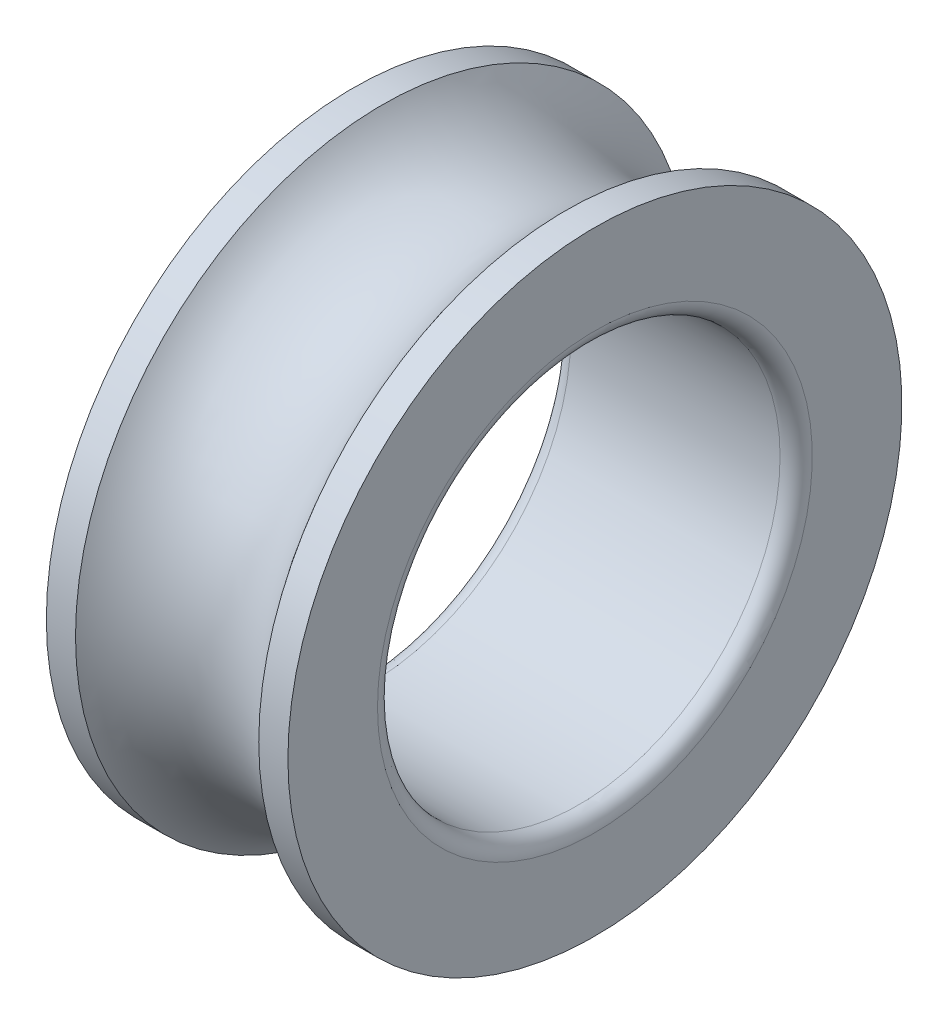
ISO-10303-21;
HEADER;
FILE_DESCRIPTION(('STEP AP214'),'2;1');
FILE_NAME('part.step','',(''),(''),'','','');
FILE_SCHEMA(('AUTOMOTIVE_DESIGN { 1 0 10303 214 1 1 1 1 }'));
ENDSEC;
DATA;
#1=APPLICATION_CONTEXT('core data for automotive mechanical design processes');
#2=APPLICATION_PROTOCOL_DEFINITION('international standard','automotive_design',2000,#1);
#3=PRODUCT_CONTEXT('',#1,'mechanical');
#4=PRODUCT('Part','Part','',(#3));
#5=PRODUCT_RELATED_PRODUCT_CATEGORY('part','',(#4));
#6=PRODUCT_DEFINITION_FORMATION('','',#4);
#7=PRODUCT_DEFINITION_CONTEXT('part definition',#1,'design');
#8=PRODUCT_DEFINITION('design','',#6,#7);
#9=PRODUCT_DEFINITION_SHAPE('','',#8);
#10=(LENGTH_UNIT() NAMED_UNIT(*) SI_UNIT(.MILLI.,.METRE.));
#11=(NAMED_UNIT(*) PLANE_ANGLE_UNIT() SI_UNIT($,.RADIAN.));
#12=(NAMED_UNIT(*) SI_UNIT($,.STERADIAN.) SOLID_ANGLE_UNIT());
#13=UNCERTAINTY_MEASURE_WITH_UNIT(LENGTH_MEASURE(1.E-05),#10,'distance_accuracy_value','');
#14=(GEOMETRIC_REPRESENTATION_CONTEXT(3) GLOBAL_UNCERTAINTY_ASSIGNED_CONTEXT((#13)) GLOBAL_UNIT_ASSIGNED_CONTEXT((#10,
#11,#12)) REPRESENTATION_CONTEXT('',''));
#15=CARTESIAN_POINT('',(0.,0.,0.));
#16=DIRECTION('',(0.,0.,1.));
#17=DIRECTION('',(1.,0.,0.));
#18=AXIS2_PLACEMENT_3D('',#15,#16,#17);
#19=CARTESIAN_POINT('',(22.5,40.5,0.));
#20=DIRECTION('',(-1.,0.,0.));
#21=DIRECTION('',(0.,0.,1.));
#22=AXIS2_PLACEMENT_3D('',#19,#20,#21);
#23=PLANE('',#22);
#24=CARTESIAN_POINT('',(22.5,0.,0.));
#25=DIRECTION('',(-1.,0.,0.));
#26=DIRECTION('',(0.,0.,1.));
#27=AXIS2_PLACEMENT_3D('',#24,#25,#26);
#28=CIRCLE('',#27,57.19);
#29=CARTESIAN_POINT('',(22.5,0.,57.19));
#30=VERTEX_POINT('',#29);
#31=EDGE_CURVE('E63',#30,#30,#28,.T.);
#32=ORIENTED_EDGE('',*,*,#31,.F.);
#33=EDGE_LOOP('',(#32));
#34=FACE_BOUND('',#33,.T.);
#35=CARTESIAN_POINT('',(22.5,0.,0.));
#36=DIRECTION('',(-1.,0.,0.));
#37=DIRECTION('',(0.,0.,1.));
#38=AXIS2_PLACEMENT_3D('',#35,#36,#37);
#39=CIRCLE('',#38,40.5);
#40=CARTESIAN_POINT('',(22.5,0.,40.5));
#41=VERTEX_POINT('',#40);
#42=EDGE_CURVE('E10',#41,#41,#39,.T.);
#43=ORIENTED_EDGE('',*,*,#42,.T.);
#44=EDGE_LOOP('',(#43));
#45=FACE_BOUND('',#44,.T.);
#46=ADVANCED_FACE('F35',(#34,#45),#23,.F.);
#47=CARTESIAN_POINT('',(19.5,0.,0.));
#48=DIRECTION('',(-1.,0.,0.));
#49=DIRECTION('',(0.,0.,1.));
#50=AXIS2_PLACEMENT_3D('',#47,#48,#49);
#51=TOROIDAL_SURFACE('',#50,40.5,3.);
#52=ORIENTED_EDGE('',*,*,#42,.F.);
#53=EDGE_LOOP('',(#52));
#54=FACE_BOUND('',#53,.T.);
#55=CARTESIAN_POINT('',(19.5,0.,0.));
#56=DIRECTION('',(-1.,0.,0.));
#57=DIRECTION('',(0.,0.,1.));
#58=AXIS2_PLACEMENT_3D('',#55,#56,#57);
#59=CIRCLE('',#58,37.5);
#60=CARTESIAN_POINT('',(19.5,0.,37.5));
#61=VERTEX_POINT('',#60);
#62=EDGE_CURVE('E41',#61,#61,#59,.T.);
#63=ORIENTED_EDGE('',*,*,#62,.T.);
#64=EDGE_LOOP('',(#63));
#65=FACE_BOUND('',#64,.T.);
#66=ADVANCED_FACE('F70',(#54,#65),#51,.T.);
#67=CARTESIAN_POINT('',(-18.9011127816473,0.,0.));
#68=DIRECTION('',(-1.,0.,0.));
#69=DIRECTION('',(0.,0.,1.));
#70=AXIS2_PLACEMENT_3D('',#67,#68,#69);
#71=CYLINDRICAL_SURFACE('',#70,37.5);
#72=ORIENTED_EDGE('',*,*,#62,.F.);
#73=EDGE_LOOP('',(#72));
#74=FACE_BOUND('',#73,.T.);
#75=CARTESIAN_POINT('',(-19.5,0.,0.));
#76=DIRECTION('',(-1.,0.,0.));
#77=DIRECTION('',(0.,0.,1.));
#78=AXIS2_PLACEMENT_3D('',#75,#76,#77);
#79=CIRCLE('',#78,37.5);
#80=CARTESIAN_POINT('',(-19.5,0.,37.5));
#81=VERTEX_POINT('',#80);
#82=EDGE_CURVE('E45',#81,#81,#79,.T.);
#83=ORIENTED_EDGE('',*,*,#82,.T.);
#84=EDGE_LOOP('',(#83));
#85=FACE_BOUND('',#84,.T.);
#86=ADVANCED_FACE('F74',(#74,#85),#71,.F.);
#87=CARTESIAN_POINT('',(-19.5,0.,0.));
#88=DIRECTION('',(-1.,0.,0.));
#89=DIRECTION('',(0.,0.,1.));
#90=AXIS2_PLACEMENT_3D('',#87,#88,#89);
#91=TOROIDAL_SURFACE('',#90,40.5,3.);
#92=ORIENTED_EDGE('',*,*,#82,.F.);
#93=EDGE_LOOP('',(#92));
#94=FACE_BOUND('',#93,.T.);
#95=CARTESIAN_POINT('',(-22.5,0.,0.));
#96=DIRECTION('',(-1.,0.,0.));
#97=DIRECTION('',(0.,0.,1.));
#98=AXIS2_PLACEMENT_3D('',#95,#96,#97);
#99=CIRCLE('',#98,40.5);
#100=CARTESIAN_POINT('',(-22.5,0.,40.5));
#101=VERTEX_POINT('',#100);
#102=EDGE_CURVE('E49',#101,#101,#99,.T.);
#103=ORIENTED_EDGE('',*,*,#102,.T.);
#104=EDGE_LOOP('',(#103));
#105=FACE_BOUND('',#104,.T.);
#106=ADVANCED_FACE('F79',(#94,#105),#91,.T.);
#107=CARTESIAN_POINT('',(-22.5,40.5,0.));
#108=DIRECTION('',(1.,0.,0.));
#109=DIRECTION('',(0.,0.,-1.));
#110=AXIS2_PLACEMENT_3D('',#107,#108,#109);
#111=PLANE('',#110);
#112=ORIENTED_EDGE('',*,*,#102,.F.);
#113=EDGE_LOOP('',(#112));
#114=FACE_BOUND('',#113,.T.);
#115=CARTESIAN_POINT('',(-22.5,0.,0.));
#116=DIRECTION('',(-1.,0.,0.));
#117=DIRECTION('',(0.,0.,1.));
#118=AXIS2_PLACEMENT_3D('',#115,#116,#117);
#119=CIRCLE('',#118,57.19);
#120=CARTESIAN_POINT('',(-22.5,0.,57.19));
#121=VERTEX_POINT('',#120);
#122=EDGE_CURVE('E54',#121,#121,#119,.T.);
#123=ORIENTED_EDGE('',*,*,#122,.T.);
#124=EDGE_LOOP('',(#123));
#125=FACE_BOUND('',#124,.T.);
#126=ADVANCED_FACE('F85',(#114,#125),#111,.F.);
#127=CARTESIAN_POINT('',(-18.9011127816473,0.,0.));
#128=DIRECTION('',(-1.,0.,0.));
#129=DIRECTION('',(0.,0.,1.));
#130=AXIS2_PLACEMENT_3D('',#127,#128,#129);
#131=CYLINDRICAL_SURFACE('',#130,57.19);
#132=ORIENTED_EDGE('',*,*,#122,.F.);
#133=EDGE_LOOP('',(#132));
#134=FACE_BOUND('',#133,.T.);
#135=CARTESIAN_POINT('',(-17.0681721341215,0.,0.));
#136=DIRECTION('',(-1.,0.,0.));
#137=DIRECTION('',(0.,0.,1.));
#138=AXIS2_PLACEMENT_3D('',#135,#136,#137);
#139=CIRCLE('',#138,57.19);
#140=CARTESIAN_POINT('',(-17.0681721341215,0.,57.19));
#141=VERTEX_POINT('',#140);
#142=EDGE_CURVE('E57',#141,#141,#139,.T.);
#143=ORIENTED_EDGE('',*,*,#142,.T.);
#144=EDGE_LOOP('',(#143));
#145=FACE_BOUND('',#144,.T.);
#146=ADVANCED_FACE('F89',(#134,#145),#131,.T.);
#147=CARTESIAN_POINT('',(0.,0.,0.));
#148=DIRECTION('',(-1.,0.,0.));
#149=DIRECTION('',(0.,0.,1.));
#150=AXIS2_PLACEMENT_3D('',#147,#148,#149);
#151=TOROIDAL_SURFACE('',#150,68.99,20.75);
#152=ORIENTED_EDGE('',*,*,#142,.F.);
#153=EDGE_LOOP('',(#152));
#154=FACE_BOUND('',#153,.T.);
#155=CARTESIAN_POINT('',(17.0681721341215,0.,0.));
#156=DIRECTION('',(-1.,0.,0.));
#157=DIRECTION('',(0.,0.,1.));
#158=AXIS2_PLACEMENT_3D('',#155,#156,#157);
#159=CIRCLE('',#158,57.19);
#160=CARTESIAN_POINT('',(17.0681721341215,0.,57.19));
#161=VERTEX_POINT('',#160);
#162=EDGE_CURVE('E60',#161,#161,#159,.T.);
#163=ORIENTED_EDGE('',*,*,#162,.T.);
#164=EDGE_LOOP('',(#163));
#165=FACE_BOUND('',#164,.T.);
#166=ADVANCED_FACE('F93',(#154,#165),#151,.F.);
#167=CARTESIAN_POINT('',(-18.9011127816473,0.,0.));
#168=DIRECTION('',(-1.,0.,0.));
#169=DIRECTION('',(0.,0.,1.));
#170=AXIS2_PLACEMENT_3D('',#167,#168,#169);
#171=CYLINDRICAL_SURFACE('',#170,57.19);
#172=ORIENTED_EDGE('',*,*,#162,.F.);
#173=EDGE_LOOP('',(#172));
#174=FACE_BOUND('',#173,.T.);
#175=ORIENTED_EDGE('',*,*,#31,.T.);
#176=EDGE_LOOP('',(#175));
#177=FACE_BOUND('',#176,.T.);
#178=ADVANCED_FACE('F67',(#174,#177),#171,.T.);
#179=CLOSED_SHELL('',(#46,#66,#86,#106,#126,#146,#166,#178));
#180=MANIFOLD_SOLID_BREP('B2',#179);
#181=ADVANCED_BREP_SHAPE_REPRESENTATION('',(#18,#180),#14);
#182=SHAPE_DEFINITION_REPRESENTATION(#9,#181);
ENDSEC;
END-ISO-10303-21;
